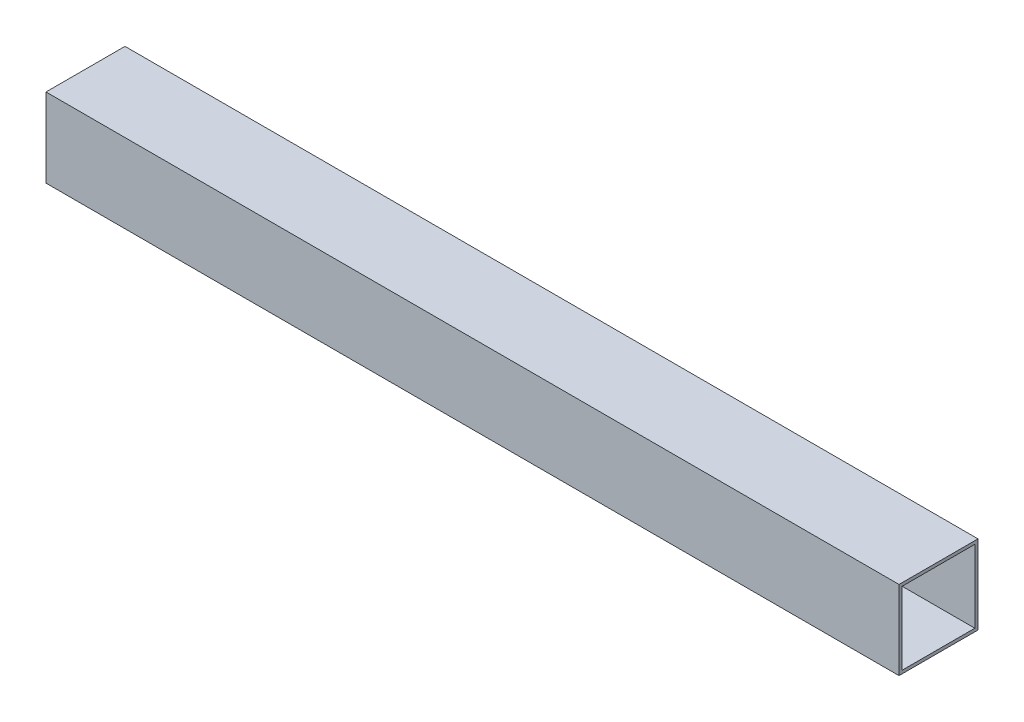
ISO-10303-21;
HEADER;
FILE_DESCRIPTION(('STEP AP214'),'2;1');
FILE_NAME('part.step','',(''),(''),'','','');
FILE_SCHEMA(('AUTOMOTIVE_DESIGN { 1 0 10303 214 1 1 1 1 }'));
ENDSEC;
DATA;
#1=APPLICATION_CONTEXT('core data for automotive mechanical design processes');
#2=APPLICATION_PROTOCOL_DEFINITION('international standard','automotive_design',2000,#1);
#3=PRODUCT_CONTEXT('',#1,'mechanical');
#4=PRODUCT('Part','Part','',(#3));
#5=PRODUCT_RELATED_PRODUCT_CATEGORY('part','',(#4));
#6=PRODUCT_DEFINITION_FORMATION('','',#4);
#7=PRODUCT_DEFINITION_CONTEXT('part definition',#1,'design');
#8=PRODUCT_DEFINITION('design','',#6,#7);
#9=PRODUCT_DEFINITION_SHAPE('','',#8);
#10=(LENGTH_UNIT() NAMED_UNIT(*) SI_UNIT(.MILLI.,.METRE.));
#11=(NAMED_UNIT(*) PLANE_ANGLE_UNIT() SI_UNIT($,.RADIAN.));
#12=(NAMED_UNIT(*) SI_UNIT($,.STERADIAN.) SOLID_ANGLE_UNIT());
#13=UNCERTAINTY_MEASURE_WITH_UNIT(LENGTH_MEASURE(1.E-05),#10,'distance_accuracy_value','');
#14=(GEOMETRIC_REPRESENTATION_CONTEXT(3) GLOBAL_UNCERTAINTY_ASSIGNED_CONTEXT((#13)) GLOBAL_UNIT_ASSIGNED_CONTEXT((#10,
#11,#12)) REPRESENTATION_CONTEXT('',''));
#15=CARTESIAN_POINT('',(0.,0.,0.));
#16=DIRECTION('',(0.,0.,1.));
#17=DIRECTION('',(1.,0.,0.));
#18=AXIS2_PLACEMENT_3D('',#15,#16,#17);
#19=CARTESIAN_POINT('',(270.,0.,0.));
#20=DIRECTION('',(1.,0.,0.));
#21=DIRECTION('',(0.,0.,-1.));
#22=AXIS2_PLACEMENT_3D('',#19,#20,#21);
#23=PLANE('',#22);
#24=DIRECTION('',(0.,-1.,0.));
#25=VECTOR('',#24,1.);
#26=CARTESIAN_POINT('',(270.,-12.5,12.5));
#27=LINE('',#26,#25);
#28=CARTESIAN_POINT('',(270.,12.5,12.5));
#29=VERTEX_POINT('',#28);
#30=CARTESIAN_POINT('',(270.,-12.5,12.5));
#31=VERTEX_POINT('',#30);
#32=EDGE_CURVE('E140',#29,#31,#27,.T.);
#33=ORIENTED_EDGE('',*,*,#32,.T.);
#34=DIRECTION('',(0.,0.,-1.));
#35=VECTOR('',#34,1.);
#36=CARTESIAN_POINT('',(270.,-12.5,-12.5));
#37=LINE('',#36,#35);
#38=CARTESIAN_POINT('',(270.,-12.5,-12.5));
#39=VERTEX_POINT('',#38);
#40=EDGE_CURVE('E143',#31,#39,#37,.T.);
#41=ORIENTED_EDGE('',*,*,#40,.T.);
#42=DIRECTION('',(0.,1.,0.));
#43=VECTOR('',#42,1.);
#44=CARTESIAN_POINT('',(270.,-12.5,-12.5));
#45=LINE('',#44,#43);
#46=CARTESIAN_POINT('',(270.,12.5,-12.5));
#47=VERTEX_POINT('',#46);
#48=EDGE_CURVE('E146',#39,#47,#45,.T.);
#49=ORIENTED_EDGE('',*,*,#48,.T.);
#50=DIRECTION('',(0.,0.,1.));
#51=VECTOR('',#50,1.);
#52=CARTESIAN_POINT('',(270.,12.5,-12.5));
#53=LINE('',#52,#51);
#54=EDGE_CURVE('E148',#47,#29,#53,.T.);
#55=ORIENTED_EDGE('',*,*,#54,.T.);
#56=EDGE_LOOP('',(#33,#41,#49,#55));
#57=FACE_BOUND('',#56,.T.);
#58=DIRECTION('',(0.,0.,-1.));
#59=VECTOR('',#58,1.);
#60=CARTESIAN_POINT('',(270.,-11.5,-11.5));
#61=LINE('',#60,#59);
#62=CARTESIAN_POINT('',(270.,-11.5,11.5));
#63=VERTEX_POINT('',#62);
#64=CARTESIAN_POINT('',(270.,-11.5,-11.5));
#65=VERTEX_POINT('',#64);
#66=EDGE_CURVE('E112',#63,#65,#61,.T.);
#67=ORIENTED_EDGE('',*,*,#66,.F.);
#68=DIRECTION('',(0.,-1.,0.));
#69=VECTOR('',#68,1.);
#70=CARTESIAN_POINT('',(270.,-11.5,11.5));
#71=LINE('',#70,#69);
#72=CARTESIAN_POINT('',(270.,11.5,11.5));
#73=VERTEX_POINT('',#72);
#74=EDGE_CURVE('E104',#73,#63,#71,.T.);
#75=ORIENTED_EDGE('',*,*,#74,.F.);
#76=DIRECTION('',(0.,0.,1.));
#77=VECTOR('',#76,1.);
#78=CARTESIAN_POINT('',(270.,11.5,-11.5));
#79=LINE('',#78,#77);
#80=CARTESIAN_POINT('',(270.,11.5,-11.5));
#81=VERTEX_POINT('',#80);
#82=EDGE_CURVE('E126',#81,#73,#79,.T.);
#83=ORIENTED_EDGE('',*,*,#82,.F.);
#84=DIRECTION('',(0.,1.,0.));
#85=VECTOR('',#84,1.);
#86=CARTESIAN_POINT('',(270.,-11.5,-11.5));
#87=LINE('',#86,#85);
#88=EDGE_CURVE('E124',#65,#81,#87,.T.);
#89=ORIENTED_EDGE('',*,*,#88,.F.);
#90=EDGE_LOOP('',(#67,#75,#83,#89));
#91=FACE_BOUND('',#90,.T.);
#92=ADVANCED_FACE('F39',(#57,#91),#23,.T.);
#93=CARTESIAN_POINT('',(0.,0.,0.));
#94=DIRECTION('',(1.,0.,0.));
#95=DIRECTION('',(0.,0.,-1.));
#96=AXIS2_PLACEMENT_3D('',#93,#94,#95);
#97=PLANE('',#96);
#98=DIRECTION('',(0.,-1.,0.));
#99=VECTOR('',#98,1.);
#100=CARTESIAN_POINT('',(0.,-12.5,12.5));
#101=LINE('',#100,#99);
#102=CARTESIAN_POINT('',(0.,12.5,12.5));
#103=VERTEX_POINT('',#102);
#104=CARTESIAN_POINT('',(0.,-12.5,12.5));
#105=VERTEX_POINT('',#104);
#106=EDGE_CURVE('E120',#103,#105,#101,.T.);
#107=ORIENTED_EDGE('',*,*,#106,.F.);
#108=DIRECTION('',(0.,0.,1.));
#109=VECTOR('',#108,1.);
#110=CARTESIAN_POINT('',(0.,12.5,-12.5));
#111=LINE('',#110,#109);
#112=CARTESIAN_POINT('',(0.,12.5,-12.5));
#113=VERTEX_POINT('',#112);
#114=EDGE_CURVE('E144',#113,#103,#111,.T.);
#115=ORIENTED_EDGE('',*,*,#114,.F.);
#116=DIRECTION('',(0.,1.,0.));
#117=VECTOR('',#116,1.);
#118=CARTESIAN_POINT('',(0.,-12.5,-12.5));
#119=LINE('',#118,#117);
#120=CARTESIAN_POINT('',(0.,-12.5,-12.5));
#121=VERTEX_POINT('',#120);
#122=EDGE_CURVE('E155',#121,#113,#119,.T.);
#123=ORIENTED_EDGE('',*,*,#122,.F.);
#124=DIRECTION('',(0.,0.,-1.));
#125=VECTOR('',#124,1.);
#126=CARTESIAN_POINT('',(0.,-12.5,-12.5));
#127=LINE('',#126,#125);
#128=EDGE_CURVE('E153',#105,#121,#127,.T.);
#129=ORIENTED_EDGE('',*,*,#128,.F.);
#130=EDGE_LOOP('',(#107,#115,#123,#129));
#131=FACE_BOUND('',#130,.T.);
#132=DIRECTION('',(0.,-1.,0.));
#133=VECTOR('',#132,1.);
#134=CARTESIAN_POINT('',(0.,-11.5,11.5));
#135=LINE('',#134,#133);
#136=CARTESIAN_POINT('',(0.,11.5,11.5));
#137=VERTEX_POINT('',#136);
#138=CARTESIAN_POINT('',(0.,-11.5,11.5));
#139=VERTEX_POINT('',#138);
#140=EDGE_CURVE('E62',#137,#139,#135,.T.);
#141=ORIENTED_EDGE('',*,*,#140,.T.);
#142=DIRECTION('',(0.,0.,-1.));
#143=VECTOR('',#142,1.);
#144=CARTESIAN_POINT('',(0.,-11.5,-11.5));
#145=LINE('',#144,#143);
#146=CARTESIAN_POINT('',(0.,-11.5,-11.5));
#147=VERTEX_POINT('',#146);
#148=EDGE_CURVE('E119',#139,#147,#145,.T.);
#149=ORIENTED_EDGE('',*,*,#148,.T.);
#150=DIRECTION('',(0.,1.,0.));
#151=VECTOR('',#150,1.);
#152=CARTESIAN_POINT('',(0.,-11.5,-11.5));
#153=LINE('',#152,#151);
#154=CARTESIAN_POINT('',(0.,11.5,-11.5));
#155=VERTEX_POINT('',#154);
#156=EDGE_CURVE('E132',#147,#155,#153,.T.);
#157=ORIENTED_EDGE('',*,*,#156,.T.);
#158=DIRECTION('',(0.,0.,1.));
#159=VECTOR('',#158,1.);
#160=CARTESIAN_POINT('',(0.,11.5,-11.5));
#161=LINE('',#160,#159);
#162=EDGE_CURVE('E113',#155,#137,#161,.T.);
#163=ORIENTED_EDGE('',*,*,#162,.T.);
#164=EDGE_LOOP('',(#141,#149,#157,#163));
#165=FACE_BOUND('',#164,.T.);
#166=ADVANCED_FACE('F173',(#131,#165),#97,.F.);
#167=CARTESIAN_POINT('',(270.,-12.5,12.5));
#168=DIRECTION('',(0.,0.,-1.));
#169=DIRECTION('',(-1.,0.,0.));
#170=AXIS2_PLACEMENT_3D('',#167,#168,#169);
#171=PLANE('',#170);
#172=ORIENTED_EDGE('',*,*,#106,.T.);
#173=DIRECTION('',(-1.,0.,0.));
#174=VECTOR('',#173,1.);
#175=CARTESIAN_POINT('',(270.,-12.5,12.5));
#176=LINE('',#175,#174);
#177=EDGE_CURVE('E11',#31,#105,#176,.T.);
#178=ORIENTED_EDGE('',*,*,#177,.F.);
#179=ORIENTED_EDGE('',*,*,#32,.F.);
#180=DIRECTION('',(-1.,0.,0.));
#181=VECTOR('',#180,1.);
#182=CARTESIAN_POINT('',(270.,12.5,12.5));
#183=LINE('',#182,#181);
#184=EDGE_CURVE('E150',#29,#103,#183,.T.);
#185=ORIENTED_EDGE('',*,*,#184,.T.);
#186=EDGE_LOOP('',(#172,#178,#179,#185));
#187=FACE_BOUND('',#186,.T.);
#188=ADVANCED_FACE('F41',(#187),#171,.F.);
#189=CARTESIAN_POINT('',(270.,-12.5,-12.5));
#190=DIRECTION('',(0.,1.,0.));
#191=DIRECTION('',(0.,0.,1.));
#192=AXIS2_PLACEMENT_3D('',#189,#190,#191);
#193=PLANE('',#192);
#194=ORIENTED_EDGE('',*,*,#128,.T.);
#195=DIRECTION('',(-1.,0.,0.));
#196=VECTOR('',#195,1.);
#197=CARTESIAN_POINT('',(270.,-12.5,-12.5));
#198=LINE('',#197,#196);
#199=EDGE_CURVE('E47',#39,#121,#198,.T.);
#200=ORIENTED_EDGE('',*,*,#199,.F.);
#201=ORIENTED_EDGE('',*,*,#40,.F.);
#202=ORIENTED_EDGE('',*,*,#177,.T.);
#203=EDGE_LOOP('',(#194,#200,#201,#202));
#204=FACE_BOUND('',#203,.T.);
#205=ADVANCED_FACE('F183',(#204),#193,.F.);
#206=CARTESIAN_POINT('',(270.,-12.5,-12.5));
#207=DIRECTION('',(0.,0.,1.));
#208=DIRECTION('',(1.,0.,0.));
#209=AXIS2_PLACEMENT_3D('',#206,#207,#208);
#210=PLANE('',#209);
#211=ORIENTED_EDGE('',*,*,#122,.T.);
#212=DIRECTION('',(-1.,0.,0.));
#213=VECTOR('',#212,1.);
#214=CARTESIAN_POINT('',(270.,12.5,-12.5));
#215=LINE('',#214,#213);
#216=EDGE_CURVE('E160',#47,#113,#215,.T.);
#217=ORIENTED_EDGE('',*,*,#216,.F.);
#218=ORIENTED_EDGE('',*,*,#48,.F.);
#219=ORIENTED_EDGE('',*,*,#199,.T.);
#220=EDGE_LOOP('',(#211,#217,#218,#219));
#221=FACE_BOUND('',#220,.T.);
#222=ADVANCED_FACE('F167',(#221),#210,.F.);
#223=CARTESIAN_POINT('',(270.,12.5,-12.5));
#224=DIRECTION('',(0.,-1.,0.));
#225=DIRECTION('',(0.,0.,-1.));
#226=AXIS2_PLACEMENT_3D('',#223,#224,#225);
#227=PLANE('',#226);
#228=ORIENTED_EDGE('',*,*,#114,.T.);
#229=ORIENTED_EDGE('',*,*,#184,.F.);
#230=ORIENTED_EDGE('',*,*,#54,.F.);
#231=ORIENTED_EDGE('',*,*,#216,.T.);
#232=EDGE_LOOP('',(#228,#229,#230,#231));
#233=FACE_BOUND('',#232,.T.);
#234=ADVANCED_FACE('F177',(#233),#227,.F.);
#235=CARTESIAN_POINT('',(270.,-11.5,11.5));
#236=DIRECTION('',(0.,0.,-1.));
#237=DIRECTION('',(-1.,0.,0.));
#238=AXIS2_PLACEMENT_3D('',#235,#236,#237);
#239=PLANE('',#238);
#240=ORIENTED_EDGE('',*,*,#140,.F.);
#241=DIRECTION('',(-1.,0.,0.));
#242=VECTOR('',#241,1.);
#243=CARTESIAN_POINT('',(270.,11.5,11.5));
#244=LINE('',#243,#242);
#245=EDGE_CURVE('E108',#73,#137,#244,.T.);
#246=ORIENTED_EDGE('',*,*,#245,.F.);
#247=ORIENTED_EDGE('',*,*,#74,.T.);
#248=DIRECTION('',(-1.,0.,0.));
#249=VECTOR('',#248,1.);
#250=CARTESIAN_POINT('',(270.,-11.5,11.5));
#251=LINE('',#250,#249);
#252=EDGE_CURVE('E107',#63,#139,#251,.T.);
#253=ORIENTED_EDGE('',*,*,#252,.T.);
#254=EDGE_LOOP('',(#240,#246,#247,#253));
#255=FACE_BOUND('',#254,.T.);
#256=ADVANCED_FACE('F106',(#255),#239,.T.);
#257=CARTESIAN_POINT('',(270.,-11.5,-11.5));
#258=DIRECTION('',(0.,1.,0.));
#259=DIRECTION('',(0.,0.,1.));
#260=AXIS2_PLACEMENT_3D('',#257,#258,#259);
#261=PLANE('',#260);
#262=ORIENTED_EDGE('',*,*,#148,.F.);
#263=ORIENTED_EDGE('',*,*,#252,.F.);
#264=ORIENTED_EDGE('',*,*,#66,.T.);
#265=DIRECTION('',(-1.,0.,0.));
#266=VECTOR('',#265,1.);
#267=CARTESIAN_POINT('',(270.,-11.5,-11.5));
#268=LINE('',#267,#266);
#269=EDGE_CURVE('E121',#65,#147,#268,.T.);
#270=ORIENTED_EDGE('',*,*,#269,.T.);
#271=EDGE_LOOP('',(#262,#263,#264,#270));
#272=FACE_BOUND('',#271,.T.);
#273=ADVANCED_FACE('F116',(#272),#261,.T.);
#274=CARTESIAN_POINT('',(270.,-11.5,-11.5));
#275=DIRECTION('',(0.,0.,1.));
#276=DIRECTION('',(1.,0.,0.));
#277=AXIS2_PLACEMENT_3D('',#274,#275,#276);
#278=PLANE('',#277);
#279=ORIENTED_EDGE('',*,*,#156,.F.);
#280=ORIENTED_EDGE('',*,*,#269,.F.);
#281=ORIENTED_EDGE('',*,*,#88,.T.);
#282=DIRECTION('',(-1.,0.,0.));
#283=VECTOR('',#282,1.);
#284=CARTESIAN_POINT('',(270.,11.5,-11.5));
#285=LINE('',#284,#283);
#286=EDGE_CURVE('E54',#81,#155,#285,.T.);
#287=ORIENTED_EDGE('',*,*,#286,.T.);
#288=EDGE_LOOP('',(#279,#280,#281,#287));
#289=FACE_BOUND('',#288,.T.);
#290=ADVANCED_FACE('F206',(#289),#278,.T.);
#291=CARTESIAN_POINT('',(270.,11.5,-11.5));
#292=DIRECTION('',(0.,-1.,0.));
#293=DIRECTION('',(0.,0.,-1.));
#294=AXIS2_PLACEMENT_3D('',#291,#292,#293);
#295=PLANE('',#294);
#296=ORIENTED_EDGE('',*,*,#162,.F.);
#297=ORIENTED_EDGE('',*,*,#286,.F.);
#298=ORIENTED_EDGE('',*,*,#82,.T.);
#299=ORIENTED_EDGE('',*,*,#245,.T.);
#300=EDGE_LOOP('',(#296,#297,#298,#299));
#301=FACE_BOUND('',#300,.T.);
#302=ADVANCED_FACE('F210',(#301),#295,.T.);
#303=CLOSED_SHELL('',(#92,#166,#188,#205,#222,#234,#256,#273,#290,#302));
#304=MANIFOLD_SOLID_BREP('B2',#303);
#305=ADVANCED_BREP_SHAPE_REPRESENTATION('',(#18,#304),#14);
#306=SHAPE_DEFINITION_REPRESENTATION(#9,#305);
ENDSEC;
END-ISO-10303-21;
